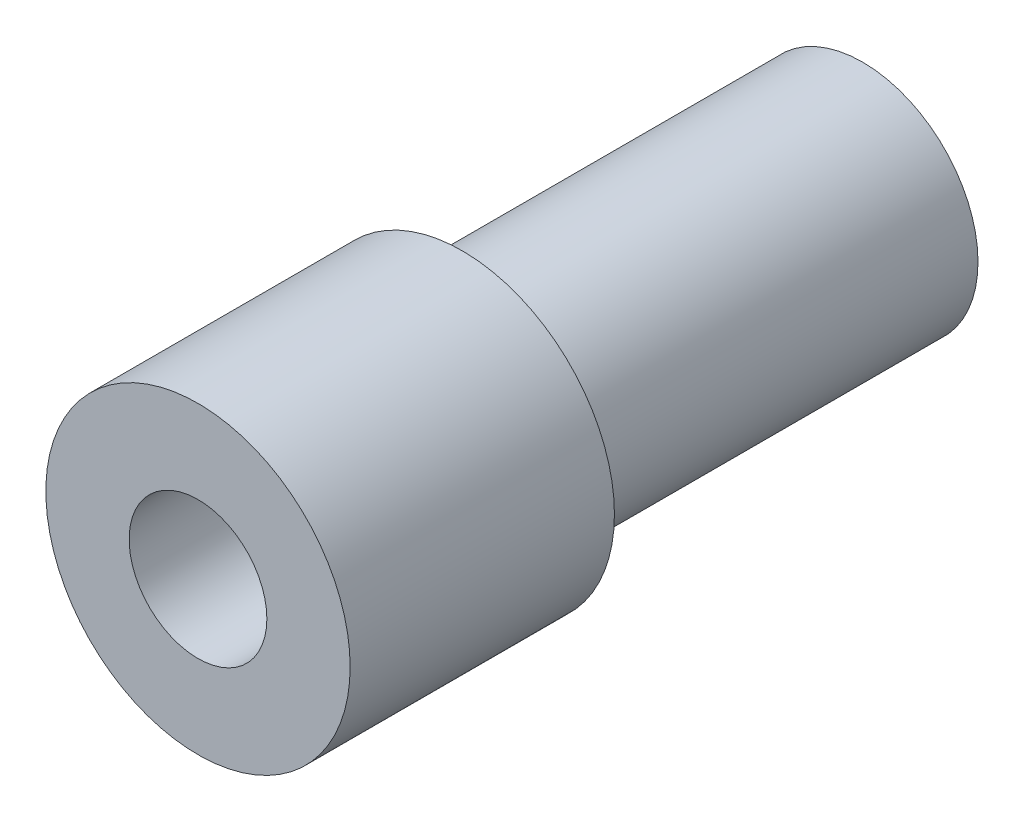
ISO-10303-21;
HEADER;
FILE_DESCRIPTION(('STEP AP214'),'2;1');
FILE_NAME('part.step','',(''),(''),'','','');
FILE_SCHEMA(('AUTOMOTIVE_DESIGN { 1 0 10303 214 1 1 1 1 }'));
ENDSEC;
DATA;
#1=APPLICATION_CONTEXT('core data for automotive mechanical design processes');
#2=APPLICATION_PROTOCOL_DEFINITION('international standard','automotive_design',2000,#1);
#3=PRODUCT_CONTEXT('',#1,'mechanical');
#4=PRODUCT('Part','Part','',(#3));
#5=PRODUCT_RELATED_PRODUCT_CATEGORY('part','',(#4));
#6=PRODUCT_DEFINITION_FORMATION('','',#4);
#7=PRODUCT_DEFINITION_CONTEXT('part definition',#1,'design');
#8=PRODUCT_DEFINITION('design','',#6,#7);
#9=PRODUCT_DEFINITION_SHAPE('','',#8);
#10=(LENGTH_UNIT() NAMED_UNIT(*) SI_UNIT(.MILLI.,.METRE.));
#11=(NAMED_UNIT(*) PLANE_ANGLE_UNIT() SI_UNIT($,.RADIAN.));
#12=(NAMED_UNIT(*) SI_UNIT($,.STERADIAN.) SOLID_ANGLE_UNIT());
#13=UNCERTAINTY_MEASURE_WITH_UNIT(LENGTH_MEASURE(1.E-05),#10,'distance_accuracy_value','');
#14=(GEOMETRIC_REPRESENTATION_CONTEXT(3) GLOBAL_UNCERTAINTY_ASSIGNED_CONTEXT((#13)) GLOBAL_UNIT_ASSIGNED_CONTEXT((#10,
#11,#12)) REPRESENTATION_CONTEXT('',''));
#15=CARTESIAN_POINT('',(0.,0.,0.));
#16=DIRECTION('',(0.,0.,1.));
#17=DIRECTION('',(1.,0.,0.));
#18=AXIS2_PLACEMENT_3D('',#15,#16,#17);
#19=CARTESIAN_POINT('',(0.,0.,0.));
#20=DIRECTION('',(0.,0.,1.));
#21=DIRECTION('',(1.,0.,0.));
#22=AXIS2_PLACEMENT_3D('',#19,#20,#21);
#23=PLANE('',#22);
#24=CARTESIAN_POINT('',(0.,0.,0.));
#25=DIRECTION('',(0.,0.,1.));
#26=DIRECTION('',(1.,0.,0.));
#27=AXIS2_PLACEMENT_3D('',#24,#25,#26);
#28=CIRCLE('',#27,14.4);
#29=CARTESIAN_POINT('',(14.4,0.,0.));
#30=VERTEX_POINT('',#29);
#31=EDGE_CURVE('E46',#30,#30,#28,.T.);
#32=ORIENTED_EDGE('',*,*,#31,.T.);
#33=EDGE_LOOP('',(#32));
#34=FACE_BOUND('',#33,.T.);
#35=CARTESIAN_POINT('',(0.,0.,0.));
#36=DIRECTION('',(0.,0.,1.));
#37=DIRECTION('',(1.,0.,0.));
#38=AXIS2_PLACEMENT_3D('',#35,#36,#37);
#39=CIRCLE('',#38,16.);
#40=CARTESIAN_POINT('',(16.,0.,0.));
#41=VERTEX_POINT('',#40);
#42=EDGE_CURVE('E10',#41,#41,#39,.T.);
#43=ORIENTED_EDGE('',*,*,#42,.F.);
#44=EDGE_LOOP('',(#43));
#45=FACE_BOUND('',#44,.T.);
#46=ADVANCED_FACE('F35',(#34,#45),#23,.F.);
#47=CARTESIAN_POINT('',(0.,0.,-80.));
#48=DIRECTION('',(0.,0.,1.));
#49=DIRECTION('',(1.,0.,0.));
#50=AXIS2_PLACEMENT_3D('',#47,#48,#49);
#51=CYLINDRICAL_SURFACE('',#50,8.6);
#52=CARTESIAN_POINT('',(0.,0.,-77.));
#53=DIRECTION('',(0.,0.,1.));
#54=DIRECTION('',(1.,0.,0.));
#55=AXIS2_PLACEMENT_3D('',#52,#53,#54);
#56=CIRCLE('',#55,8.6);
#57=CARTESIAN_POINT('',(8.6,0.,-77.));
#58=VERTEX_POINT('',#57);
#59=EDGE_CURVE('E64',#58,#58,#56,.T.);
#60=ORIENTED_EDGE('',*,*,#59,.F.);
#61=EDGE_LOOP('',(#60));
#62=FACE_BOUND('',#61,.T.);
#63=CARTESIAN_POINT('',(0.,0.,3.));
#64=DIRECTION('',(0.,0.,1.));
#65=DIRECTION('',(1.,0.,0.));
#66=AXIS2_PLACEMENT_3D('',#63,#64,#65);
#67=CIRCLE('',#66,8.6);
#68=CARTESIAN_POINT('',(8.6,0.,3.));
#69=VERTEX_POINT('',#68);
#70=EDGE_CURVE('E51',#69,#69,#67,.T.);
#71=ORIENTED_EDGE('',*,*,#70,.T.);
#72=EDGE_LOOP('',(#71));
#73=FACE_BOUND('',#72,.T.);
#74=ADVANCED_FACE('F37',(#62,#73),#51,.F.);
#75=CARTESIAN_POINT('',(0.,0.,-80.));
#76=DIRECTION('',(0.,0.,1.));
#77=DIRECTION('',(1.,0.,0.));
#78=AXIS2_PLACEMENT_3D('',#75,#76,#77);
#79=CYLINDRICAL_SURFACE('',#78,14.4);
#80=CARTESIAN_POINT('',(0.,0.,-80.));
#81=DIRECTION('',(0.,0.,1.));
#82=DIRECTION('',(1.,0.,0.));
#83=AXIS2_PLACEMENT_3D('',#80,#81,#82);
#84=CIRCLE('',#83,14.4);
#85=CARTESIAN_POINT('',(14.4,0.,-80.));
#86=VERTEX_POINT('',#85);
#87=EDGE_CURVE('E42',#86,#86,#84,.T.);
#88=ORIENTED_EDGE('',*,*,#87,.T.);
#89=EDGE_LOOP('',(#88));
#90=FACE_BOUND('',#89,.T.);
#91=ORIENTED_EDGE('',*,*,#31,.F.);
#92=EDGE_LOOP('',(#91));
#93=FACE_BOUND('',#92,.T.);
#94=ADVANCED_FACE('F72',(#90,#93),#79,.T.);
#95=CARTESIAN_POINT('',(0.,0.,-80.));
#96=DIRECTION('',(0.,0.,1.));
#97=DIRECTION('',(1.,0.,0.));
#98=AXIS2_PLACEMENT_3D('',#95,#96,#97);
#99=PLANE('',#98);
#100=ORIENTED_EDGE('',*,*,#87,.F.);
#101=EDGE_LOOP('',(#100));
#102=FACE_BOUND('',#101,.T.);
#103=ADVANCED_FACE('F88',(#102),#99,.F.);
#104=CARTESIAN_POINT('',(0.,0.,3.));
#105=DIRECTION('',(0.,0.,-1.));
#106=DIRECTION('',(-1.,0.,0.));
#107=AXIS2_PLACEMENT_3D('',#104,#105,#106);
#108=CYLINDRICAL_SURFACE('',#107,19.);
#109=CARTESIAN_POINT('',(0.,0.,3.));
#110=DIRECTION('',(0.,0.,1.));
#111=DIRECTION('',(1.,0.,0.));
#112=AXIS2_PLACEMENT_3D('',#109,#110,#111);
#113=CIRCLE('',#112,19.);
#114=CARTESIAN_POINT('',(19.,0.,3.));
#115=VERTEX_POINT('',#114);
#116=EDGE_CURVE('E55',#115,#115,#113,.T.);
#117=ORIENTED_EDGE('',*,*,#116,.F.);
#118=EDGE_LOOP('',(#117));
#119=FACE_BOUND('',#118,.T.);
#120=CARTESIAN_POINT('',(0.,0.,-30.));
#121=DIRECTION('',(0.,0.,1.));
#122=DIRECTION('',(1.,0.,0.));
#123=AXIS2_PLACEMENT_3D('',#120,#121,#122);
#124=CIRCLE('',#123,19.);
#125=CARTESIAN_POINT('',(19.,0.,-30.));
#126=VERTEX_POINT('',#125);
#127=EDGE_CURVE('E58',#126,#126,#124,.T.);
#128=ORIENTED_EDGE('',*,*,#127,.T.);
#129=EDGE_LOOP('',(#128));
#130=FACE_BOUND('',#129,.T.);
#131=ADVANCED_FACE('F78',(#119,#130),#108,.T.);
#132=CARTESIAN_POINT('',(0.,0.,3.));
#133=DIRECTION('',(0.,0.,1.));
#134=DIRECTION('',(1.,0.,0.));
#135=AXIS2_PLACEMENT_3D('',#132,#133,#134);
#136=PLANE('',#135);
#137=ORIENTED_EDGE('',*,*,#116,.T.);
#138=EDGE_LOOP('',(#137));
#139=FACE_BOUND('',#138,.T.);
#140=ORIENTED_EDGE('',*,*,#70,.F.);
#141=EDGE_LOOP('',(#140));
#142=FACE_BOUND('',#141,.T.);
#143=ADVANCED_FACE('F75',(#139,#142),#136,.T.);
#144=CARTESIAN_POINT('',(0.,0.,-30.));
#145=DIRECTION('',(0.,0.,1.));
#146=DIRECTION('',(1.,0.,0.));
#147=AXIS2_PLACEMENT_3D('',#144,#145,#146);
#148=CYLINDRICAL_SURFACE('',#147,16.);
#149=CARTESIAN_POINT('',(0.,0.,-30.));
#150=DIRECTION('',(0.,0.,1.));
#151=DIRECTION('',(1.,0.,0.));
#152=AXIS2_PLACEMENT_3D('',#149,#150,#151);
#153=CIRCLE('',#152,16.);
#154=CARTESIAN_POINT('',(16.,0.,-30.));
#155=VERTEX_POINT('',#154);
#156=EDGE_CURVE('E61',#155,#155,#153,.T.);
#157=ORIENTED_EDGE('',*,*,#156,.F.);
#158=EDGE_LOOP('',(#157));
#159=FACE_BOUND('',#158,.T.);
#160=ORIENTED_EDGE('',*,*,#42,.T.);
#161=EDGE_LOOP('',(#160));
#162=FACE_BOUND('',#161,.T.);
#163=ADVANCED_FACE('F77',(#159,#162),#148,.F.);
#164=CARTESIAN_POINT('',(0.,0.,-30.));
#165=DIRECTION('',(0.,0.,1.));
#166=DIRECTION('',(1.,0.,0.));
#167=AXIS2_PLACEMENT_3D('',#164,#165,#166);
#168=PLANE('',#167);
#169=ORIENTED_EDGE('',*,*,#156,.T.);
#170=EDGE_LOOP('',(#169));
#171=FACE_BOUND('',#170,.T.);
#172=ORIENTED_EDGE('',*,*,#127,.F.);
#173=EDGE_LOOP('',(#172));
#174=FACE_BOUND('',#173,.T.);
#175=ADVANCED_FACE('F85',(#171,#174),#168,.F.);
#176=CARTESIAN_POINT('',(0.,0.,-77.));
#177=DIRECTION('',(0.,0.,1.));
#178=DIRECTION('',(1.,0.,0.));
#179=AXIS2_PLACEMENT_3D('',#176,#177,#178);
#180=PLANE('',#179);
#181=ORIENTED_EDGE('',*,*,#59,.T.);
#182=EDGE_LOOP('',(#181));
#183=FACE_BOUND('',#182,.T.);
#184=ADVANCED_FACE('F68',(#183),#180,.T.);
#185=CLOSED_SHELL('',(#46,#74,#94,#103,#131,#143,#163,#175,#184));
#186=MANIFOLD_SOLID_BREP('B2',#185);
#187=ADVANCED_BREP_SHAPE_REPRESENTATION('',(#18,#186),#14);
#188=SHAPE_DEFINITION_REPRESENTATION(#9,#187);
ENDSEC;
END-ISO-10303-21;
